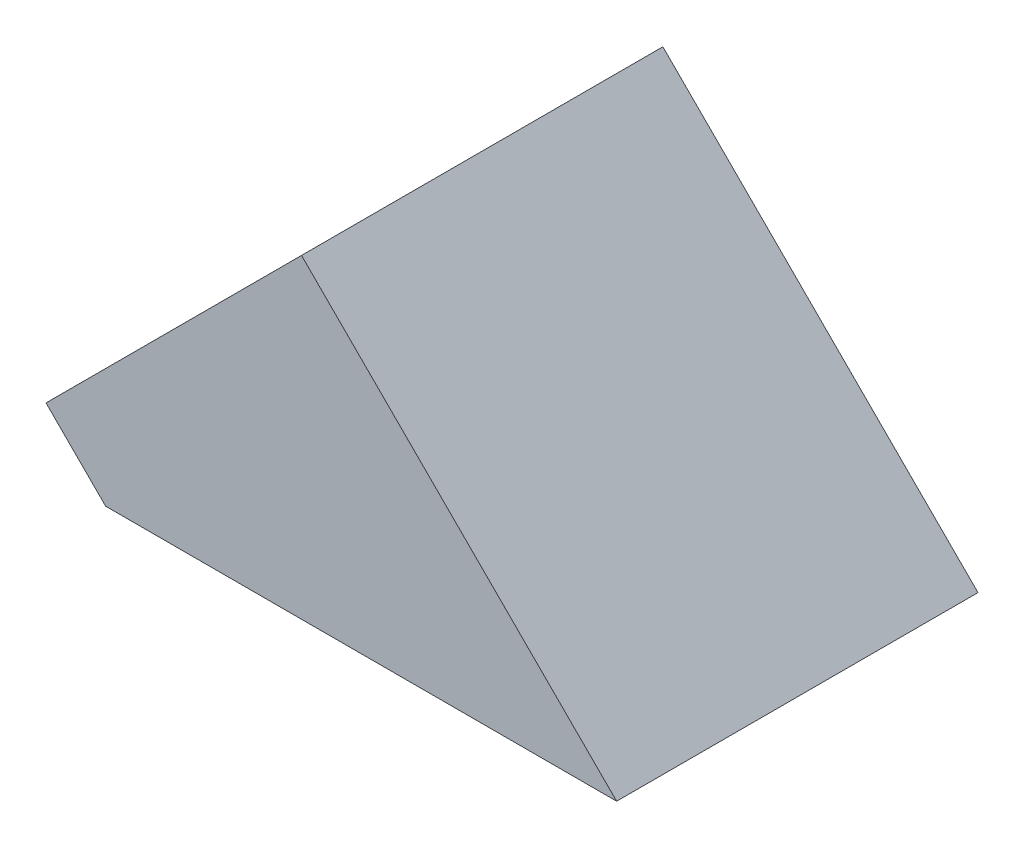
ISO-10303-21;
HEADER;
FILE_DESCRIPTION(('STEP AP214'),'2;1');
FILE_NAME('part.step','',(''),(''),'','','');
FILE_SCHEMA(('AUTOMOTIVE_DESIGN { 1 0 10303 214 1 1 1 1 }'));
ENDSEC;
DATA;
#1=APPLICATION_CONTEXT('core data for automotive mechanical design processes');
#2=APPLICATION_PROTOCOL_DEFINITION('international standard','automotive_design',2000,#1);
#3=PRODUCT_CONTEXT('',#1,'mechanical');
#4=PRODUCT('Part','Part','',(#3));
#5=PRODUCT_RELATED_PRODUCT_CATEGORY('part','',(#4));
#6=PRODUCT_DEFINITION_FORMATION('','',#4);
#7=PRODUCT_DEFINITION_CONTEXT('part definition',#1,'design');
#8=PRODUCT_DEFINITION('design','',#6,#7);
#9=PRODUCT_DEFINITION_SHAPE('','',#8);
#10=(LENGTH_UNIT() NAMED_UNIT(*) SI_UNIT(.MILLI.,.METRE.));
#11=(NAMED_UNIT(*) PLANE_ANGLE_UNIT() SI_UNIT($,.RADIAN.));
#12=(NAMED_UNIT(*) SI_UNIT($,.STERADIAN.) SOLID_ANGLE_UNIT());
#13=UNCERTAINTY_MEASURE_WITH_UNIT(LENGTH_MEASURE(1.E-05),#10,'distance_accuracy_value','');
#14=(GEOMETRIC_REPRESENTATION_CONTEXT(3) GLOBAL_UNCERTAINTY_ASSIGNED_CONTEXT((#13)) GLOBAL_UNIT_ASSIGNED_CONTEXT((#10,
#11,#12)) REPRESENTATION_CONTEXT('',''));
#15=CARTESIAN_POINT('',(0.,0.,0.));
#16=DIRECTION('',(0.,0.,1.));
#17=DIRECTION('',(1.,0.,0.));
#18=AXIS2_PLACEMENT_3D('',#15,#16,#17);
#19=CARTESIAN_POINT('',(-4.94974746830512,4.94974746830507,30.));
#20=DIRECTION('',(0.707106781186544,0.707106781186551,0.));
#21=DIRECTION('',(-0.707106781186551,0.707106781186544,0.));
#22=AXIS2_PLACEMENT_3D('',#19,#20,#21);
#23=PLANE('',#22);
#24=DIRECTION('',(0.707106781186551,-0.707106781186544,0.));
#25=VECTOR('',#24,1.);
#26=CARTESIAN_POINT('',(-4.94974746830512,4.94974746830507,0.));
#27=LINE('',#26,#25);
#28=CARTESIAN_POINT('',(-4.94974746830512,4.94974746830507,0.));
#29=VERTEX_POINT('',#28);
#30=CARTESIAN_POINT('',(0.,0.,0.));
#31=VERTEX_POINT('',#30);
#32=EDGE_CURVE('E100',#29,#31,#27,.T.);
#33=ORIENTED_EDGE('',*,*,#32,.T.);
#34=DIRECTION('',(0.,0.,-1.));
#35=VECTOR('',#34,1.);
#36=CARTESIAN_POINT('',(0.,0.,30.));
#37=LINE('',#36,#35);
#38=CARTESIAN_POINT('',(0.,0.,30.));
#39=VERTEX_POINT('',#38);
#40=EDGE_CURVE('E11',#39,#31,#37,.T.);
#41=ORIENTED_EDGE('',*,*,#40,.F.);
#42=DIRECTION('',(0.707106781186551,-0.707106781186544,0.));
#43=VECTOR('',#42,1.);
#44=CARTESIAN_POINT('',(-4.94974746830512,4.94974746830507,30.));
#45=LINE('',#44,#43);
#46=CARTESIAN_POINT('',(-4.94974746830512,4.94974746830507,30.));
#47=VERTEX_POINT('',#46);
#48=EDGE_CURVE('E88',#47,#39,#45,.T.);
#49=ORIENTED_EDGE('',*,*,#48,.F.);
#50=DIRECTION('',(0.,0.,-1.));
#51=VECTOR('',#50,1.);
#52=CARTESIAN_POINT('',(-4.94974746830512,4.94974746830507,30.));
#53=LINE('',#52,#51);
#54=EDGE_CURVE('E96',#47,#29,#53,.T.);
#55=ORIENTED_EDGE('',*,*,#54,.T.);
#56=EDGE_LOOP('',(#33,#41,#49,#55));
#57=FACE_BOUND('',#56,.T.);
#58=ADVANCED_FACE('F37',(#57),#23,.F.);
#59=CARTESIAN_POINT('',(0.,0.,30.));
#60=DIRECTION('',(0.,1.,0.));
#61=DIRECTION('',(-1.,0.,0.));
#62=AXIS2_PLACEMENT_3D('',#59,#60,#61);
#63=PLANE('',#62);
#64=DIRECTION('',(1.,0.,0.));
#65=VECTOR('',#64,1.);
#66=CARTESIAN_POINT('',(0.,0.,0.));
#67=LINE('',#66,#65);
#68=CARTESIAN_POINT('',(42.4264068711936,0.,0.));
#69=VERTEX_POINT('',#68);
#70=EDGE_CURVE('E92',#31,#69,#67,.T.);
#71=ORIENTED_EDGE('',*,*,#70,.T.);
#72=DIRECTION('',(0.,0.,-1.));
#73=VECTOR('',#72,1.);
#74=CARTESIAN_POINT('',(42.4264068711936,0.,30.));
#75=LINE('',#74,#73);
#76=CARTESIAN_POINT('',(42.4264068711936,0.,30.));
#77=VERTEX_POINT('',#76);
#78=EDGE_CURVE('E45',#77,#69,#75,.T.);
#79=ORIENTED_EDGE('',*,*,#78,.F.);
#80=DIRECTION('',(1.,0.,0.));
#81=VECTOR('',#80,1.);
#82=CARTESIAN_POINT('',(0.,0.,30.));
#83=LINE('',#82,#81);
#84=EDGE_CURVE('E83',#39,#77,#83,.T.);
#85=ORIENTED_EDGE('',*,*,#84,.F.);
#86=ORIENTED_EDGE('',*,*,#40,.T.);
#87=EDGE_LOOP('',(#71,#79,#85,#86));
#88=FACE_BOUND('',#87,.T.);
#89=ADVANCED_FACE('F91',(#88),#63,.F.);
#90=CARTESIAN_POINT('',(42.4264068711936,0.,30.));
#91=DIRECTION('',(-0.707106781186536,-0.707106781186559,0.));
#92=DIRECTION('',(0.707106781186559,-0.707106781186536,0.));
#93=AXIS2_PLACEMENT_3D('',#90,#91,#92);
#94=PLANE('',#93);
#95=DIRECTION('',(-0.707106781186559,0.707106781186536,0.));
#96=VECTOR('',#95,1.);
#97=CARTESIAN_POINT('',(42.4264068711936,0.,0.));
#98=LINE('',#97,#96);
#99=CARTESIAN_POINT('',(16.263455967291,26.1629509039018,0.));
#100=VERTEX_POINT('',#99);
#101=EDGE_CURVE('E70',#69,#100,#98,.T.);
#102=ORIENTED_EDGE('',*,*,#101,.T.);
#103=DIRECTION('',(0.,0.,-1.));
#104=VECTOR('',#103,1.);
#105=CARTESIAN_POINT('',(16.263455967291,26.1629509039018,30.));
#106=LINE('',#105,#104);
#107=CARTESIAN_POINT('',(16.263455967291,26.1629509039018,30.));
#108=VERTEX_POINT('',#107);
#109=EDGE_CURVE('E93',#108,#100,#106,.T.);
#110=ORIENTED_EDGE('',*,*,#109,.F.);
#111=DIRECTION('',(-0.707106781186559,0.707106781186536,0.));
#112=VECTOR('',#111,1.);
#113=CARTESIAN_POINT('',(42.4264068711936,0.,30.));
#114=LINE('',#113,#112);
#115=EDGE_CURVE('E86',#77,#108,#114,.T.);
#116=ORIENTED_EDGE('',*,*,#115,.F.);
#117=ORIENTED_EDGE('',*,*,#78,.T.);
#118=EDGE_LOOP('',(#102,#110,#116,#117));
#119=FACE_BOUND('',#118,.T.);
#120=ADVANCED_FACE('F94',(#119),#94,.F.);
#121=CARTESIAN_POINT('',(16.263455967291,26.1629509039018,30.));
#122=DIRECTION('',(0.707106781186559,-0.707106781186536,0.));
#123=DIRECTION('',(0.707106781186536,0.707106781186559,0.));
#124=AXIS2_PLACEMENT_3D('',#121,#122,#123);
#125=PLANE('',#124);
#126=DIRECTION('',(-0.707106781186536,-0.707106781186559,0.));
#127=VECTOR('',#126,1.);
#128=CARTESIAN_POINT('',(16.263455967291,26.1629509039018,0.));
#129=LINE('',#128,#127);
#130=EDGE_CURVE('E76',#100,#29,#129,.T.);
#131=ORIENTED_EDGE('',*,*,#130,.T.);
#132=ORIENTED_EDGE('',*,*,#54,.F.);
#133=DIRECTION('',(-0.707106781186536,-0.707106781186559,0.));
#134=VECTOR('',#133,1.);
#135=CARTESIAN_POINT('',(16.263455967291,26.1629509039018,30.));
#136=LINE('',#135,#134);
#137=EDGE_CURVE('E53',#108,#47,#136,.T.);
#138=ORIENTED_EDGE('',*,*,#137,.F.);
#139=ORIENTED_EDGE('',*,*,#109,.T.);
#140=EDGE_LOOP('',(#131,#132,#138,#139));
#141=FACE_BOUND('',#140,.T.);
#142=ADVANCED_FACE('F107',(#141),#125,.F.);
#143=CARTESIAN_POINT('',(0.,0.,30.));
#144=DIRECTION('',(0.,0.,-1.));
#145=DIRECTION('',(-1.,0.,0.));
#146=AXIS2_PLACEMENT_3D('',#143,#144,#145);
#147=PLANE('',#146);
#148=ORIENTED_EDGE('',*,*,#48,.T.);
#149=ORIENTED_EDGE('',*,*,#84,.T.);
#150=ORIENTED_EDGE('',*,*,#115,.T.);
#151=ORIENTED_EDGE('',*,*,#137,.T.);
#152=EDGE_LOOP('',(#148,#149,#150,#151));
#153=FACE_BOUND('',#152,.T.);
#154=ADVANCED_FACE('F84',(#153),#147,.F.);
#155=CARTESIAN_POINT('',(0.,0.,0.));
#156=DIRECTION('',(0.,0.,-1.));
#157=DIRECTION('',(-1.,0.,0.));
#158=AXIS2_PLACEMENT_3D('',#155,#156,#157);
#159=PLANE('',#158);
#160=ORIENTED_EDGE('',*,*,#32,.F.);
#161=ORIENTED_EDGE('',*,*,#130,.F.);
#162=ORIENTED_EDGE('',*,*,#101,.F.);
#163=ORIENTED_EDGE('',*,*,#70,.F.);
#164=EDGE_LOOP('',(#160,#161,#162,#163));
#165=FACE_BOUND('',#164,.T.);
#166=ADVANCED_FACE('F110',(#165),#159,.T.);
#167=CLOSED_SHELL('',(#58,#89,#120,#142,#154,#166));
#168=MANIFOLD_SOLID_BREP('B2',#167);
#169=ADVANCED_BREP_SHAPE_REPRESENTATION('',(#18,#168),#14);
#170=SHAPE_DEFINITION_REPRESENTATION(#9,#169);
ENDSEC;
END-ISO-10303-21;
